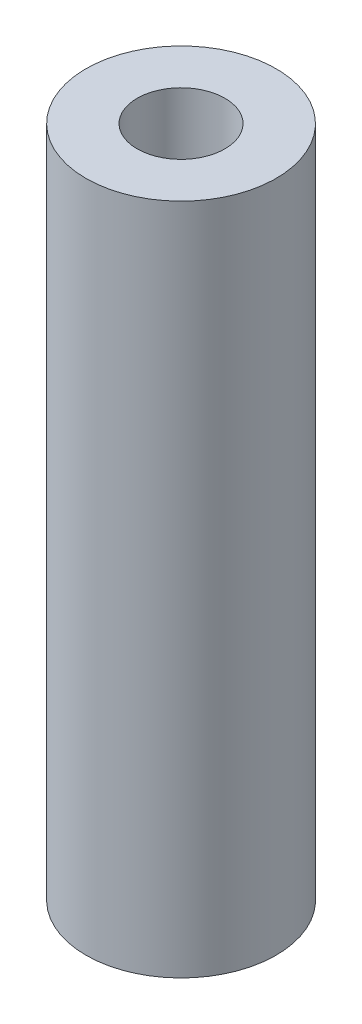
ISO-10303-21;
HEADER;
FILE_DESCRIPTION(('STEP AP214'),'2;1');
FILE_NAME('part.step','',(''),(''),'','','');
FILE_SCHEMA(('AUTOMOTIVE_DESIGN { 1 0 10303 214 1 1 1 1 }'));
ENDSEC;
DATA;
#1=APPLICATION_CONTEXT('core data for automotive mechanical design processes');
#2=APPLICATION_PROTOCOL_DEFINITION('international standard','automotive_design',2000,#1);
#3=PRODUCT_CONTEXT('',#1,'mechanical');
#4=PRODUCT('Part','Part','',(#3));
#5=PRODUCT_RELATED_PRODUCT_CATEGORY('part','',(#4));
#6=PRODUCT_DEFINITION_FORMATION('','',#4);
#7=PRODUCT_DEFINITION_CONTEXT('part definition',#1,'design');
#8=PRODUCT_DEFINITION('design','',#6,#7);
#9=PRODUCT_DEFINITION_SHAPE('','',#8);
#10=(LENGTH_UNIT() NAMED_UNIT(*) SI_UNIT(.MILLI.,.METRE.));
#11=(NAMED_UNIT(*) PLANE_ANGLE_UNIT() SI_UNIT($,.RADIAN.));
#12=(NAMED_UNIT(*) SI_UNIT($,.STERADIAN.) SOLID_ANGLE_UNIT());
#13=UNCERTAINTY_MEASURE_WITH_UNIT(LENGTH_MEASURE(1.E-05),#10,'distance_accuracy_value','');
#14=(GEOMETRIC_REPRESENTATION_CONTEXT(3) GLOBAL_UNCERTAINTY_ASSIGNED_CONTEXT((#13)) GLOBAL_UNIT_ASSIGNED_CONTEXT((#10,
#11,#12)) REPRESENTATION_CONTEXT('',''));
#15=CARTESIAN_POINT('',(0.,0.,0.));
#16=DIRECTION('',(0.,0.,1.));
#17=DIRECTION('',(1.,0.,0.));
#18=AXIS2_PLACEMENT_3D('',#15,#16,#17);
#19=CARTESIAN_POINT('',(0.,23.,0.));
#20=DIRECTION('',(0.,-1.,0.));
#21=DIRECTION('',(0.,0.,-1.));
#22=AXIS2_PLACEMENT_3D('',#19,#20,#21);
#23=CYLINDRICAL_SURFACE('',#22,3.25);
#24=CARTESIAN_POINT('',(0.,23.,0.));
#25=DIRECTION('',(0.,1.,0.));
#26=DIRECTION('',(0.,0.,1.));
#27=AXIS2_PLACEMENT_3D('',#24,#25,#26);
#28=CIRCLE('',#27,3.25);
#29=CARTESIAN_POINT('',(0.,23.,3.25));
#30=VERTEX_POINT('',#29);
#31=EDGE_CURVE('E10',#30,#30,#28,.T.);
#32=ORIENTED_EDGE('',*,*,#31,.F.);
#33=EDGE_LOOP('',(#32));
#34=FACE_BOUND('',#33,.T.);
#35=CARTESIAN_POINT('',(0.,0.,0.));
#36=DIRECTION('',(0.,1.,0.));
#37=DIRECTION('',(0.,0.,1.));
#38=AXIS2_PLACEMENT_3D('',#35,#36,#37);
#39=CIRCLE('',#38,3.25);
#40=CARTESIAN_POINT('',(0.,0.,3.25));
#41=VERTEX_POINT('',#40);
#42=EDGE_CURVE('E40',#41,#41,#39,.T.);
#43=ORIENTED_EDGE('',*,*,#42,.T.);
#44=EDGE_LOOP('',(#43));
#45=FACE_BOUND('',#44,.T.);
#46=ADVANCED_FACE('F37',(#34,#45),#23,.T.);
#47=CARTESIAN_POINT('',(0.,23.,0.));
#48=DIRECTION('',(0.,1.,0.));
#49=DIRECTION('',(0.,0.,1.));
#50=AXIS2_PLACEMENT_3D('',#47,#48,#49);
#51=PLANE('',#50);
#52=CARTESIAN_POINT('',(0.,23.,0.));
#53=DIRECTION('',(0.,1.,0.));
#54=DIRECTION('',(0.,0.,1.));
#55=AXIS2_PLACEMENT_3D('',#52,#53,#54);
#56=CIRCLE('',#55,1.5);
#57=CARTESIAN_POINT('',(0.,23.,1.5));
#58=VERTEX_POINT('',#57);
#59=EDGE_CURVE('E49',#58,#58,#56,.F.);
#60=ORIENTED_EDGE('',*,*,#59,.T.);
#61=EDGE_LOOP('',(#60));
#62=FACE_BOUND('',#61,.T.);
#63=ORIENTED_EDGE('',*,*,#31,.T.);
#64=EDGE_LOOP('',(#63));
#65=FACE_BOUND('',#64,.T.);
#66=ADVANCED_FACE('F69',(#62,#65),#51,.T.);
#67=CARTESIAN_POINT('',(0.,0.,0.));
#68=DIRECTION('',(0.,1.,0.));
#69=DIRECTION('',(0.,0.,1.));
#70=AXIS2_PLACEMENT_3D('',#67,#68,#69);
#71=PLANE('',#70);
#72=CARTESIAN_POINT('',(0.,0.,0.));
#73=DIRECTION('',(0.,1.,0.));
#74=DIRECTION('',(0.,0.,1.));
#75=AXIS2_PLACEMENT_3D('',#72,#73,#74);
#76=CIRCLE('',#75,1.5);
#77=CARTESIAN_POINT('',(0.,0.,1.5));
#78=VERTEX_POINT('',#77);
#79=EDGE_CURVE('E54',#78,#78,#76,.T.);
#80=ORIENTED_EDGE('',*,*,#79,.T.);
#81=EDGE_LOOP('',(#80));
#82=FACE_BOUND('',#81,.T.);
#83=ORIENTED_EDGE('',*,*,#42,.F.);
#84=EDGE_LOOP('',(#83));
#85=FACE_BOUND('',#84,.T.);
#86=ADVANCED_FACE('F59',(#82,#85),#71,.F.);
#87=CARTESIAN_POINT('',(0.,28.,0.));
#88=DIRECTION('',(0.,-1.,0.));
#89=DIRECTION('',(0.,0.,-1.));
#90=AXIS2_PLACEMENT_3D('',#87,#88,#89);
#91=CYLINDRICAL_SURFACE('',#90,1.5);
#92=ORIENTED_EDGE('',*,*,#59,.F.);
#93=EDGE_LOOP('',(#92));
#94=FACE_BOUND('',#93,.T.);
#95=ORIENTED_EDGE('',*,*,#79,.F.);
#96=EDGE_LOOP('',(#95));
#97=FACE_BOUND('',#96,.T.);
#98=ADVANCED_FACE('F62',(#94,#97),#91,.F.);
#99=CLOSED_SHELL('',(#46,#66,#86,#98));
#100=MANIFOLD_SOLID_BREP('B2',#99);
#101=ADVANCED_BREP_SHAPE_REPRESENTATION('',(#18,#100),#14);
#102=SHAPE_DEFINITION_REPRESENTATION(#9,#101);
ENDSEC;
END-ISO-10303-21;
